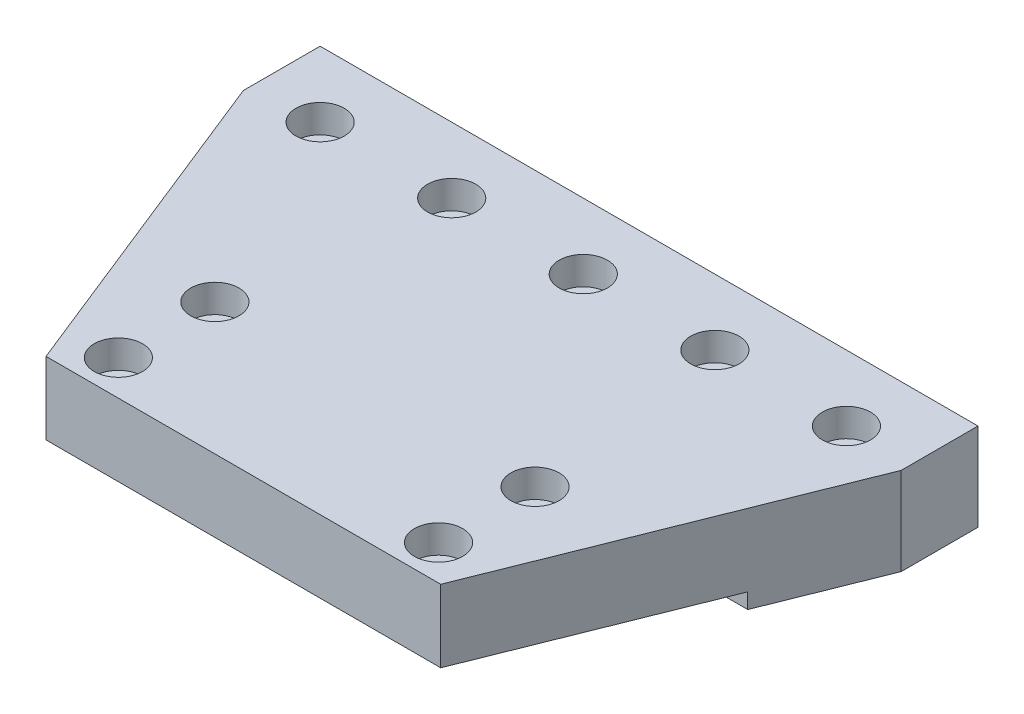
ISO-10303-21;
HEADER;
FILE_DESCRIPTION(('STEP AP214'),'2;1');
FILE_NAME('part.step','',(''),(''),'','','');
FILE_SCHEMA(('AUTOMOTIVE_DESIGN { 1 0 10303 214 1 1 1 1 }'));
ENDSEC;
DATA;
#1=APPLICATION_CONTEXT('core data for automotive mechanical design processes');
#2=APPLICATION_PROTOCOL_DEFINITION('international standard','automotive_design',2000,#1);
#3=PRODUCT_CONTEXT('',#1,'mechanical');
#4=PRODUCT('Part','Part','',(#3));
#5=PRODUCT_RELATED_PRODUCT_CATEGORY('part','',(#4));
#6=PRODUCT_DEFINITION_FORMATION('','',#4);
#7=PRODUCT_DEFINITION_CONTEXT('part definition',#1,'design');
#8=PRODUCT_DEFINITION('design','',#6,#7);
#9=PRODUCT_DEFINITION_SHAPE('','',#8);
#10=(LENGTH_UNIT() NAMED_UNIT(*) SI_UNIT(.MILLI.,.METRE.));
#11=(NAMED_UNIT(*) PLANE_ANGLE_UNIT() SI_UNIT($,.RADIAN.));
#12=(NAMED_UNIT(*) SI_UNIT($,.STERADIAN.) SOLID_ANGLE_UNIT());
#13=UNCERTAINTY_MEASURE_WITH_UNIT(LENGTH_MEASURE(1.E-05),#10,'distance_accuracy_value','');
#14=(GEOMETRIC_REPRESENTATION_CONTEXT(3) GLOBAL_UNCERTAINTY_ASSIGNED_CONTEXT((#13)) GLOBAL_UNIT_ASSIGNED_CONTEXT((#10,
#11,#12)) REPRESENTATION_CONTEXT('',''));
#15=CARTESIAN_POINT('',(0.,0.,0.));
#16=DIRECTION('',(0.,0.,1.));
#17=DIRECTION('',(1.,0.,0.));
#18=AXIS2_PLACEMENT_3D('',#15,#16,#17);
#19=CARTESIAN_POINT('',(75.,10.,-46.25));
#20=DIRECTION('',(-1.,0.,0.));
#21=DIRECTION('',(0.,0.,1.));
#22=AXIS2_PLACEMENT_3D('',#19,#20,#21);
#23=PLANE('',#22);
#24=DIRECTION('',(0.,0.,-1.));
#25=VECTOR('',#24,1.);
#26=CARTESIAN_POINT('',(75.,10.,-46.25));
#27=LINE('',#26,#25);
#28=CARTESIAN_POINT('',(75.,10.,-28.7500000000007));
#29=VERTEX_POINT('',#28);
#30=CARTESIAN_POINT('',(75.,10.,-46.25));
#31=VERTEX_POINT('',#30);
#32=EDGE_CURVE('E317',#29,#31,#27,.T.);
#33=ORIENTED_EDGE('',*,*,#32,.F.);
#34=DIRECTION('',(0.,-1.,0.));
#35=VECTOR('',#34,1.);
#36=CARTESIAN_POINT('',(75.,10.,-28.7500000000007));
#37=LINE('',#36,#35);
#38=CARTESIAN_POINT('',(75.,-10.,-28.7500000000007));
#39=VERTEX_POINT('',#38);
#40=EDGE_CURVE('E152',#29,#39,#37,.T.);
#41=ORIENTED_EDGE('',*,*,#40,.T.);
#42=DIRECTION('',(0.,0.,-1.));
#43=VECTOR('',#42,1.);
#44=CARTESIAN_POINT('',(75.,-10.,-46.25));
#45=LINE('',#44,#43);
#46=CARTESIAN_POINT('',(75.,-10.,-46.25));
#47=VERTEX_POINT('',#46);
#48=EDGE_CURVE('E316',#39,#47,#45,.T.);
#49=ORIENTED_EDGE('',*,*,#48,.T.);
#50=DIRECTION('',(0.,-1.,0.));
#51=VECTOR('',#50,1.);
#52=CARTESIAN_POINT('',(75.,10.,-46.25));
#53=LINE('',#52,#51);
#54=EDGE_CURVE('E146',#31,#47,#53,.T.);
#55=ORIENTED_EDGE('',*,*,#54,.F.);
#56=EDGE_LOOP('',(#33,#41,#49,#55));
#57=FACE_BOUND('',#56,.T.);
#58=ADVANCED_FACE('F45',(#57),#23,.F.);
#59=CARTESIAN_POINT('',(-75.,10.,-46.25));
#60=DIRECTION('',(0.,0.,1.));
#61=DIRECTION('',(1.,0.,0.));
#62=AXIS2_PLACEMENT_3D('',#59,#60,#61);
#63=PLANE('',#62);
#64=DIRECTION('',(-1.,0.,0.));
#65=VECTOR('',#64,1.);
#66=CARTESIAN_POINT('',(-75.,-10.,-46.25));
#67=LINE('',#66,#65);
#68=CARTESIAN_POINT('',(-75.,-10.,-46.25));
#69=VERTEX_POINT('',#68);
#70=EDGE_CURVE('E334',#47,#69,#67,.T.);
#71=ORIENTED_EDGE('',*,*,#70,.T.);
#72=DIRECTION('',(0.,-1.,0.));
#73=VECTOR('',#72,1.);
#74=CARTESIAN_POINT('',(-75.,10.,-46.25));
#75=LINE('',#74,#73);
#76=CARTESIAN_POINT('',(-75.,10.,-46.25));
#77=VERTEX_POINT('',#76);
#78=EDGE_CURVE('E331',#77,#69,#75,.T.);
#79=ORIENTED_EDGE('',*,*,#78,.F.);
#80=DIRECTION('',(-1.,0.,0.));
#81=VECTOR('',#80,1.);
#82=CARTESIAN_POINT('',(-75.,10.,-46.25));
#83=LINE('',#82,#81);
#84=EDGE_CURVE('E320',#31,#77,#83,.T.);
#85=ORIENTED_EDGE('',*,*,#84,.F.);
#86=ORIENTED_EDGE('',*,*,#54,.T.);
#87=EDGE_LOOP('',(#71,#79,#85,#86));
#88=FACE_BOUND('',#87,.T.);
#89=ADVANCED_FACE('F346',(#88),#63,.F.);
#90=CARTESIAN_POINT('',(-75.,10.,-46.25));
#91=DIRECTION('',(1.,0.,0.));
#92=DIRECTION('',(0.,0.,-1.));
#93=AXIS2_PLACEMENT_3D('',#90,#91,#92);
#94=PLANE('',#93);
#95=DIRECTION('',(0.,0.,1.));
#96=VECTOR('',#95,1.);
#97=CARTESIAN_POINT('',(-75.,-10.,-46.25));
#98=LINE('',#97,#96);
#99=CARTESIAN_POINT('',(-75.,-10.,-28.7500000000007));
#100=VERTEX_POINT('',#99);
#101=EDGE_CURVE('E321',#69,#100,#98,.T.);
#102=ORIENTED_EDGE('',*,*,#101,.T.);
#103=DIRECTION('',(0.,1.,0.));
#104=VECTOR('',#103,1.);
#105=CARTESIAN_POINT('',(-75.,10.,-28.7500000000007));
#106=LINE('',#105,#104);
#107=CARTESIAN_POINT('',(-75.,10.,-28.7500000000007));
#108=VERTEX_POINT('',#107);
#109=EDGE_CURVE('E137',#100,#108,#106,.T.);
#110=ORIENTED_EDGE('',*,*,#109,.T.);
#111=DIRECTION('',(0.,0.,1.));
#112=VECTOR('',#111,1.);
#113=CARTESIAN_POINT('',(-75.,10.,-46.25));
#114=LINE('',#113,#112);
#115=EDGE_CURVE('E324',#77,#108,#114,.T.);
#116=ORIENTED_EDGE('',*,*,#115,.F.);
#117=ORIENTED_EDGE('',*,*,#78,.T.);
#118=EDGE_LOOP('',(#102,#110,#116,#117));
#119=FACE_BOUND('',#118,.T.);
#120=ADVANCED_FACE('F353',(#119),#94,.F.);
#121=CARTESIAN_POINT('',(-75.,10.,46.25));
#122=DIRECTION('',(0.,0.,-1.));
#123=DIRECTION('',(-1.,0.,0.));
#124=AXIS2_PLACEMENT_3D('',#121,#122,#123);
#125=PLANE('',#124);
#126=DIRECTION('',(0.,-1.,0.));
#127=VECTOR('',#126,1.);
#128=CARTESIAN_POINT('',(-44.9999999999999,10.,46.25));
#129=LINE('',#128,#127);
#130=CARTESIAN_POINT('',(-44.9999999999999,10.,46.25));
#131=VERTEX_POINT('',#130);
#132=CARTESIAN_POINT('',(-44.9999999999999,-6.5,46.25));
#133=VERTEX_POINT('',#132);
#134=EDGE_CURVE('E139',#131,#133,#129,.T.);
#135=ORIENTED_EDGE('',*,*,#134,.T.);
#136=DIRECTION('',(1.,0.,0.));
#137=VECTOR('',#136,1.);
#138=CARTESIAN_POINT('',(-75.,-6.5,46.25));
#139=LINE('',#138,#137);
#140=CARTESIAN_POINT('',(44.9999999999999,-6.5,46.25));
#141=VERTEX_POINT('',#140);
#142=EDGE_CURVE('E184',#133,#141,#139,.T.);
#143=ORIENTED_EDGE('',*,*,#142,.T.);
#144=DIRECTION('',(0.,1.,0.));
#145=VECTOR('',#144,1.);
#146=CARTESIAN_POINT('',(44.9999999999999,10.,46.25));
#147=LINE('',#146,#145);
#148=CARTESIAN_POINT('',(44.9999999999999,10.,46.25));
#149=VERTEX_POINT('',#148);
#150=EDGE_CURVE('E69',#141,#149,#147,.T.);
#151=ORIENTED_EDGE('',*,*,#150,.T.);
#152=DIRECTION('',(1.,0.,0.));
#153=VECTOR('',#152,1.);
#154=CARTESIAN_POINT('',(-75.,10.,46.25));
#155=LINE('',#154,#153);
#156=EDGE_CURVE('E328',#131,#149,#155,.T.);
#157=ORIENTED_EDGE('',*,*,#156,.F.);
#158=EDGE_LOOP('',(#135,#143,#151,#157));
#159=FACE_BOUND('',#158,.T.);
#160=ADVANCED_FACE('F358',(#159),#125,.F.);
#161=CARTESIAN_POINT('',(0.,10.,0.));
#162=DIRECTION('',(0.,1.,0.));
#163=DIRECTION('',(0.,0.,1.));
#164=AXIS2_PLACEMENT_3D('',#161,#162,#163);
#165=PLANE('',#164);
#166=CARTESIAN_POINT('',(-36.5,10.,38.25));
#167=DIRECTION('',(0.,1.,0.));
#168=DIRECTION('',(0.,0.,1.));
#169=AXIS2_PLACEMENT_3D('',#166,#167,#168);
#170=CIRCLE('',#169,5.49999999999999);
#171=CARTESIAN_POINT('',(-36.5,10.,43.75));
#172=VERTEX_POINT('',#171);
#173=EDGE_CURVE('E121',#172,#172,#170,.T.);
#174=ORIENTED_EDGE('',*,*,#173,.F.);
#175=EDGE_LOOP('',(#174));
#176=FACE_BOUND('',#175,.T.);
#177=CARTESIAN_POINT('',(-36.5,10.,16.25));
#178=DIRECTION('',(0.,1.,0.));
#179=DIRECTION('',(0.,0.,1.));
#180=AXIS2_PLACEMENT_3D('',#177,#178,#179);
#181=CIRCLE('',#180,5.49999999999999);
#182=CARTESIAN_POINT('',(-36.5,10.,21.75));
#183=VERTEX_POINT('',#182);
#184=EDGE_CURVE('E200',#183,#183,#181,.T.);
#185=ORIENTED_EDGE('',*,*,#184,.F.);
#186=EDGE_LOOP('',(#185));
#187=FACE_BOUND('',#186,.T.);
#188=CARTESIAN_POINT('',(36.5,10.,16.25));
#189=DIRECTION('',(0.,1.,0.));
#190=DIRECTION('',(0.,0.,1.));
#191=AXIS2_PLACEMENT_3D('',#188,#189,#190);
#192=CIRCLE('',#191,5.49999999999999);
#193=CARTESIAN_POINT('',(36.5,10.,21.75));
#194=VERTEX_POINT('',#193);
#195=EDGE_CURVE('E212',#194,#194,#192,.T.);
#196=ORIENTED_EDGE('',*,*,#195,.F.);
#197=EDGE_LOOP('',(#196));
#198=FACE_BOUND('',#197,.T.);
#199=CARTESIAN_POINT('',(36.5,10.,38.25));
#200=DIRECTION('',(0.,1.,0.));
#201=DIRECTION('',(0.,0.,1.));
#202=AXIS2_PLACEMENT_3D('',#199,#200,#201);
#203=CIRCLE('',#202,5.49999999999999);
#204=CARTESIAN_POINT('',(36.5,10.,43.75));
#205=VERTEX_POINT('',#204);
#206=EDGE_CURVE('E224',#205,#205,#203,.T.);
#207=ORIENTED_EDGE('',*,*,#206,.F.);
#208=EDGE_LOOP('',(#207));
#209=FACE_BOUND('',#208,.T.);
#210=CARTESIAN_POINT('',(-60.,10.,-31.25));
#211=DIRECTION('',(0.,1.,0.));
#212=DIRECTION('',(0.,0.,1.));
#213=AXIS2_PLACEMENT_3D('',#210,#211,#212);
#214=CIRCLE('',#213,5.49999999999999);
#215=CARTESIAN_POINT('',(-60.,10.,-25.75));
#216=VERTEX_POINT('',#215);
#217=EDGE_CURVE('E236',#216,#216,#214,.T.);
#218=ORIENTED_EDGE('',*,*,#217,.F.);
#219=EDGE_LOOP('',(#218));
#220=FACE_BOUND('',#219,.T.);
#221=CARTESIAN_POINT('',(-30.,10.,-31.25));
#222=DIRECTION('',(0.,1.,0.));
#223=DIRECTION('',(0.,0.,1.));
#224=AXIS2_PLACEMENT_3D('',#221,#222,#223);
#225=CIRCLE('',#224,5.49999999999999);
#226=CARTESIAN_POINT('',(-30.,10.,-25.75));
#227=VERTEX_POINT('',#226);
#228=EDGE_CURVE('E252',#227,#227,#225,.T.);
#229=ORIENTED_EDGE('',*,*,#228,.F.);
#230=EDGE_LOOP('',(#229));
#231=FACE_BOUND('',#230,.T.);
#232=CARTESIAN_POINT('',(0.,10.,-31.25));
#233=DIRECTION('',(0.,1.,0.));
#234=DIRECTION('',(0.,0.,1.));
#235=AXIS2_PLACEMENT_3D('',#232,#233,#234);
#236=CIRCLE('',#235,5.49999999999999);
#237=CARTESIAN_POINT('',(0.,10.,-25.75));
#238=VERTEX_POINT('',#237);
#239=EDGE_CURVE('E268',#238,#238,#236,.T.);
#240=ORIENTED_EDGE('',*,*,#239,.F.);
#241=EDGE_LOOP('',(#240));
#242=FACE_BOUND('',#241,.T.);
#243=CARTESIAN_POINT('',(30.,10.,-31.25));
#244=DIRECTION('',(0.,1.,0.));
#245=DIRECTION('',(0.,0.,1.));
#246=AXIS2_PLACEMENT_3D('',#243,#244,#245);
#247=CIRCLE('',#246,5.49999999999999);
#248=CARTESIAN_POINT('',(30.,10.,-25.75));
#249=VERTEX_POINT('',#248);
#250=EDGE_CURVE('E284',#249,#249,#247,.T.);
#251=ORIENTED_EDGE('',*,*,#250,.F.);
#252=EDGE_LOOP('',(#251));
#253=FACE_BOUND('',#252,.T.);
#254=CARTESIAN_POINT('',(60.,10.,-31.25));
#255=DIRECTION('',(0.,1.,0.));
#256=DIRECTION('',(0.,0.,1.));
#257=AXIS2_PLACEMENT_3D('',#254,#255,#256);
#258=CIRCLE('',#257,5.49999999999999);
#259=CARTESIAN_POINT('',(60.,10.,-25.75));
#260=VERTEX_POINT('',#259);
#261=EDGE_CURVE('E300',#260,#260,#258,.T.);
#262=ORIENTED_EDGE('',*,*,#261,.F.);
#263=EDGE_LOOP('',(#262));
#264=FACE_BOUND('',#263,.T.);
#265=ORIENTED_EDGE('',*,*,#156,.T.);
#266=DIRECTION('',(-0.371390676354101,0.,0.92847669088526));
#267=VECTOR('',#266,1.);
#268=CARTESIAN_POINT('',(54.7413793103448,10.,21.8965517241377));
#269=LINE('',#268,#267);
#270=EDGE_CURVE('E55',#149,#29,#269,.F.);
#271=ORIENTED_EDGE('',*,*,#270,.T.);
#272=ORIENTED_EDGE('',*,*,#32,.T.);
#273=ORIENTED_EDGE('',*,*,#84,.T.);
#274=ORIENTED_EDGE('',*,*,#115,.T.);
#275=DIRECTION('',(-0.371390676354102,0.,-0.92847669088526));
#276=VECTOR('',#275,1.);
#277=CARTESIAN_POINT('',(-54.7413793103448,10.,21.8965517241378));
#278=LINE('',#277,#276);
#279=EDGE_CURVE('E143',#108,#131,#278,.F.);
#280=ORIENTED_EDGE('',*,*,#279,.T.);
#281=EDGE_LOOP('',(#265,#271,#272,#273,#274,#280));
#282=FACE_BOUND('',#281,.T.);
#283=ADVANCED_FACE('F356',(#176,#187,#198,#209,#220,#231,#242,#253,#264,#282),#165,.T.);
#284=CARTESIAN_POINT('',(0.,-10.,0.));
#285=DIRECTION('',(0.,1.,0.));
#286=DIRECTION('',(0.,0.,1.));
#287=AXIS2_PLACEMENT_3D('',#284,#285,#286);
#288=PLANE('',#287);
#289=CARTESIAN_POINT('',(-60.,-10.,-31.25));
#290=DIRECTION('',(0.,1.,0.));
#291=DIRECTION('',(0.,0.,1.));
#292=AXIS2_PLACEMENT_3D('',#289,#290,#291);
#293=CIRCLE('',#292,3.3);
#294=CARTESIAN_POINT('',(-60.,-10.,-27.95));
#295=VERTEX_POINT('',#294);
#296=EDGE_CURVE('E248',#295,#295,#293,.T.);
#297=ORIENTED_EDGE('',*,*,#296,.T.);
#298=EDGE_LOOP('',(#297));
#299=FACE_BOUND('',#298,.T.);
#300=CARTESIAN_POINT('',(-30.,-10.,-31.25));
#301=DIRECTION('',(0.,1.,0.));
#302=DIRECTION('',(0.,0.,1.));
#303=AXIS2_PLACEMENT_3D('',#300,#301,#302);
#304=CIRCLE('',#303,3.29999999999999);
#305=CARTESIAN_POINT('',(-30.,-10.,-27.95));
#306=VERTEX_POINT('',#305);
#307=EDGE_CURVE('E264',#306,#306,#304,.T.);
#308=ORIENTED_EDGE('',*,*,#307,.T.);
#309=EDGE_LOOP('',(#308));
#310=FACE_BOUND('',#309,.T.);
#311=CARTESIAN_POINT('',(0.,-10.,-31.25));
#312=DIRECTION('',(0.,1.,0.));
#313=DIRECTION('',(0.,0.,1.));
#314=AXIS2_PLACEMENT_3D('',#311,#312,#313);
#315=CIRCLE('',#314,3.29999999999999);
#316=CARTESIAN_POINT('',(0.,-10.,-27.95));
#317=VERTEX_POINT('',#316);
#318=EDGE_CURVE('E280',#317,#317,#315,.T.);
#319=ORIENTED_EDGE('',*,*,#318,.T.);
#320=EDGE_LOOP('',(#319));
#321=FACE_BOUND('',#320,.T.);
#322=CARTESIAN_POINT('',(30.,-10.,-31.25));
#323=DIRECTION('',(0.,1.,0.));
#324=DIRECTION('',(0.,0.,1.));
#325=AXIS2_PLACEMENT_3D('',#322,#323,#324);
#326=CIRCLE('',#325,3.3);
#327=CARTESIAN_POINT('',(30.,-10.,-27.95));
#328=VERTEX_POINT('',#327);
#329=EDGE_CURVE('E296',#328,#328,#326,.T.);
#330=ORIENTED_EDGE('',*,*,#329,.T.);
#331=EDGE_LOOP('',(#330));
#332=FACE_BOUND('',#331,.T.);
#333=CARTESIAN_POINT('',(60.,-10.,-31.25));
#334=DIRECTION('',(0.,1.,0.));
#335=DIRECTION('',(0.,0.,1.));
#336=AXIS2_PLACEMENT_3D('',#333,#334,#335);
#337=CIRCLE('',#336,3.3);
#338=CARTESIAN_POINT('',(60.,-10.,-27.95));
#339=VERTEX_POINT('',#338);
#340=EDGE_CURVE('E312',#339,#339,#337,.T.);
#341=ORIENTED_EDGE('',*,*,#340,.T.);
#342=EDGE_LOOP('',(#341));
#343=FACE_BOUND('',#342,.T.);
#344=DIRECTION('',(0.371390676354101,0.,-0.92847669088526));
#345=VECTOR('',#344,1.);
#346=CARTESIAN_POINT('',(75.,-10.,-28.7500000000007));
#347=LINE('',#346,#345);
#348=CARTESIAN_POINT('',(64.9999999999998,-10.,-3.75000000000001));
#349=VERTEX_POINT('',#348);
#350=EDGE_CURVE('E131',#39,#349,#347,.F.);
#351=ORIENTED_EDGE('',*,*,#350,.T.);
#352=DIRECTION('',(1.,0.,0.));
#353=VECTOR('',#352,1.);
#354=CARTESIAN_POINT('',(-75.,-10.,-3.75));
#355=LINE('',#354,#353);
#356=CARTESIAN_POINT('',(-64.9999999999998,-10.,-3.75000000000001));
#357=VERTEX_POINT('',#356);
#358=EDGE_CURVE('E115',#357,#349,#355,.T.);
#359=ORIENTED_EDGE('',*,*,#358,.F.);
#360=DIRECTION('',(0.371390676354102,0.,0.92847669088526));
#361=VECTOR('',#360,1.);
#362=CARTESIAN_POINT('',(-44.9999999999999,-10.,46.25));
#363=LINE('',#362,#361);
#364=EDGE_CURVE('E128',#357,#100,#363,.F.);
#365=ORIENTED_EDGE('',*,*,#364,.T.);
#366=ORIENTED_EDGE('',*,*,#101,.F.);
#367=ORIENTED_EDGE('',*,*,#70,.F.);
#368=ORIENTED_EDGE('',*,*,#48,.F.);
#369=EDGE_LOOP('',(#351,#359,#365,#366,#367,#368));
#370=FACE_BOUND('',#369,.T.);
#371=ADVANCED_FACE('F126',(#299,#310,#321,#332,#343,#370),#288,.F.);
#372=CARTESIAN_POINT('',(-44.9999999999999,10.,46.25));
#373=DIRECTION('',(0.92847669088526,0.,-0.371390676354101));
#374=DIRECTION('',(0.,-1.,0.));
#375=AXIS2_PLACEMENT_3D('',#372,#373,#374);
#376=PLANE('',#375);
#377=DIRECTION('',(0.,1.,0.));
#378=VECTOR('',#377,1.);
#379=CARTESIAN_POINT('',(-64.9999999999998,10.,-3.75));
#380=LINE('',#379,#378);
#381=CARTESIAN_POINT('',(-64.9999999999998,-6.5,-3.75000000000001));
#382=VERTEX_POINT('',#381);
#383=EDGE_CURVE('E112',#382,#357,#380,.F.);
#384=ORIENTED_EDGE('',*,*,#383,.F.);
#385=DIRECTION('',(0.371390676354102,0.,0.92847669088526));
#386=VECTOR('',#385,1.);
#387=CARTESIAN_POINT('',(-44.9999999999999,-6.5,46.25));
#388=LINE('',#387,#386);
#389=EDGE_CURVE('E122',#133,#382,#388,.F.);
#390=ORIENTED_EDGE('',*,*,#389,.F.);
#391=ORIENTED_EDGE('',*,*,#134,.F.);
#392=ORIENTED_EDGE('',*,*,#279,.F.);
#393=ORIENTED_EDGE('',*,*,#109,.F.);
#394=ORIENTED_EDGE('',*,*,#364,.F.);
#395=EDGE_LOOP('',(#384,#390,#391,#392,#393,#394));
#396=FACE_BOUND('',#395,.T.);
#397=ADVANCED_FACE('F135',(#396),#376,.F.);
#398=CARTESIAN_POINT('',(75.,10.,-28.7500000000007));
#399=DIRECTION('',(-0.92847669088526,0.,-0.371390676354101));
#400=DIRECTION('',(0.,-1.,0.));
#401=AXIS2_PLACEMENT_3D('',#398,#399,#400);
#402=PLANE('',#401);
#403=DIRECTION('',(0.,-1.,0.));
#404=VECTOR('',#403,1.);
#405=CARTESIAN_POINT('',(64.9999999999998,10.,-3.75));
#406=LINE('',#405,#404);
#407=CARTESIAN_POINT('',(64.9999999999998,-6.5,-3.75000000000001));
#408=VERTEX_POINT('',#407);
#409=EDGE_CURVE('E11',#349,#408,#406,.F.);
#410=ORIENTED_EDGE('',*,*,#409,.F.);
#411=ORIENTED_EDGE('',*,*,#350,.F.);
#412=ORIENTED_EDGE('',*,*,#40,.F.);
#413=ORIENTED_EDGE('',*,*,#270,.F.);
#414=ORIENTED_EDGE('',*,*,#150,.F.);
#415=DIRECTION('',(0.371390676354101,0.,-0.92847669088526));
#416=VECTOR('',#415,1.);
#417=CARTESIAN_POINT('',(75.,-6.5,-28.7500000000007));
#418=LINE('',#417,#416);
#419=EDGE_CURVE('E181',#408,#141,#418,.F.);
#420=ORIENTED_EDGE('',*,*,#419,.F.);
#421=EDGE_LOOP('',(#410,#411,#412,#413,#414,#420));
#422=FACE_BOUND('',#421,.T.);
#423=ADVANCED_FACE('F48',(#422),#402,.F.);
#424=CARTESIAN_POINT('',(60.,10.,-31.25));
#425=DIRECTION('',(0.,1.,0.));
#426=DIRECTION('',(0.,0.,1.));
#427=AXIS2_PLACEMENT_3D('',#424,#425,#426);
#428=CYLINDRICAL_SURFACE('',#427,3.3);
#429=ORIENTED_EDGE('',*,*,#340,.F.);
#430=EDGE_LOOP('',(#429));
#431=FACE_BOUND('',#430,.T.);
#432=CARTESIAN_POINT('',(60.,3.6,-31.25));
#433=DIRECTION('',(0.,1.,0.));
#434=DIRECTION('',(0.,0.,1.));
#435=AXIS2_PLACEMENT_3D('',#432,#433,#434);
#436=CIRCLE('',#435,3.30000000000001);
#437=CARTESIAN_POINT('',(60.,3.6,-27.95));
#438=VERTEX_POINT('',#437);
#439=EDGE_CURVE('E308',#438,#438,#436,.T.);
#440=ORIENTED_EDGE('',*,*,#439,.T.);
#441=EDGE_LOOP('',(#440));
#442=FACE_BOUND('',#441,.T.);
#443=ADVANCED_FACE('F421',(#431,#442),#428,.F.);
#444=CARTESIAN_POINT('',(63.3,3.6,-31.25));
#445=DIRECTION('',(0.,-1.,0.));
#446=DIRECTION('',(0.,0.,-1.));
#447=AXIS2_PLACEMENT_3D('',#444,#445,#446);
#448=PLANE('',#447);
#449=ORIENTED_EDGE('',*,*,#439,.F.);
#450=EDGE_LOOP('',(#449));
#451=FACE_BOUND('',#450,.T.);
#452=CARTESIAN_POINT('',(60.,3.6,-31.25));
#453=DIRECTION('',(0.,1.,0.));
#454=DIRECTION('',(0.,0.,1.));
#455=AXIS2_PLACEMENT_3D('',#452,#453,#454);
#456=CIRCLE('',#455,5.49999999999999);
#457=CARTESIAN_POINT('',(60.,3.6,-25.75));
#458=VERTEX_POINT('',#457);
#459=EDGE_CURVE('E304',#458,#458,#456,.T.);
#460=ORIENTED_EDGE('',*,*,#459,.T.);
#461=EDGE_LOOP('',(#460));
#462=FACE_BOUND('',#461,.T.);
#463=ADVANCED_FACE('F411',(#451,#462),#448,.F.);
#464=CARTESIAN_POINT('',(60.,10.,-31.25));
#465=DIRECTION('',(0.,1.,0.));
#466=DIRECTION('',(0.,0.,1.));
#467=AXIS2_PLACEMENT_3D('',#464,#465,#466);
#468=CYLINDRICAL_SURFACE('',#467,5.49999999999999);
#469=ORIENTED_EDGE('',*,*,#459,.F.);
#470=EDGE_LOOP('',(#469));
#471=FACE_BOUND('',#470,.T.);
#472=ORIENTED_EDGE('',*,*,#261,.T.);
#473=EDGE_LOOP('',(#472));
#474=FACE_BOUND('',#473,.T.);
#475=ADVANCED_FACE('F408',(#471,#474),#468,.F.);
#476=CARTESIAN_POINT('',(30.,10.,-31.25));
#477=DIRECTION('',(0.,1.,0.));
#478=DIRECTION('',(0.,0.,1.));
#479=AXIS2_PLACEMENT_3D('',#476,#477,#478);
#480=CYLINDRICAL_SURFACE('',#479,3.3);
#481=ORIENTED_EDGE('',*,*,#329,.F.);
#482=EDGE_LOOP('',(#481));
#483=FACE_BOUND('',#482,.T.);
#484=CARTESIAN_POINT('',(30.,3.6,-31.25));
#485=DIRECTION('',(0.,1.,0.));
#486=DIRECTION('',(0.,0.,1.));
#487=AXIS2_PLACEMENT_3D('',#484,#485,#486);
#488=CIRCLE('',#487,3.30000000000001);
#489=CARTESIAN_POINT('',(30.,3.6,-27.95));
#490=VERTEX_POINT('',#489);
#491=EDGE_CURVE('E292',#490,#490,#488,.T.);
#492=ORIENTED_EDGE('',*,*,#491,.T.);
#493=EDGE_LOOP('',(#492));
#494=FACE_BOUND('',#493,.T.);
#495=ADVANCED_FACE('F410',(#483,#494),#480,.F.);
#496=CARTESIAN_POINT('',(33.3,3.6,-31.25));
#497=DIRECTION('',(0.,-1.,0.));
#498=DIRECTION('',(0.,0.,-1.));
#499=AXIS2_PLACEMENT_3D('',#496,#497,#498);
#500=PLANE('',#499);
#501=ORIENTED_EDGE('',*,*,#491,.F.);
#502=EDGE_LOOP('',(#501));
#503=FACE_BOUND('',#502,.T.);
#504=CARTESIAN_POINT('',(30.,3.6,-31.25));
#505=DIRECTION('',(0.,1.,0.));
#506=DIRECTION('',(0.,0.,1.));
#507=AXIS2_PLACEMENT_3D('',#504,#505,#506);
#508=CIRCLE('',#507,5.49999999999999);
#509=CARTESIAN_POINT('',(30.,3.6,-25.75));
#510=VERTEX_POINT('',#509);
#511=EDGE_CURVE('E288',#510,#510,#508,.T.);
#512=ORIENTED_EDGE('',*,*,#511,.T.);
#513=EDGE_LOOP('',(#512));
#514=FACE_BOUND('',#513,.T.);
#515=ADVANCED_FACE('F418',(#503,#514),#500,.F.);
#516=CARTESIAN_POINT('',(30.,10.,-31.25));
#517=DIRECTION('',(0.,1.,0.));
#518=DIRECTION('',(0.,0.,1.));
#519=AXIS2_PLACEMENT_3D('',#516,#517,#518);
#520=CYLINDRICAL_SURFACE('',#519,5.49999999999999);
#521=ORIENTED_EDGE('',*,*,#511,.F.);
#522=EDGE_LOOP('',(#521));
#523=FACE_BOUND('',#522,.T.);
#524=ORIENTED_EDGE('',*,*,#250,.T.);
#525=EDGE_LOOP('',(#524));
#526=FACE_BOUND('',#525,.T.);
#527=ADVANCED_FACE('F692',(#523,#526),#520,.F.);
#528=CARTESIAN_POINT('',(0.,10.,-31.25));
#529=DIRECTION('',(0.,1.,0.));
#530=DIRECTION('',(0.,0.,1.));
#531=AXIS2_PLACEMENT_3D('',#528,#529,#530);
#532=CYLINDRICAL_SURFACE('',#531,3.3);
#533=ORIENTED_EDGE('',*,*,#318,.F.);
#534=EDGE_LOOP('',(#533));
#535=FACE_BOUND('',#534,.T.);
#536=CARTESIAN_POINT('',(0.,3.6,-31.25));
#537=DIRECTION('',(0.,1.,0.));
#538=DIRECTION('',(0.,0.,1.));
#539=AXIS2_PLACEMENT_3D('',#536,#537,#538);
#540=CIRCLE('',#539,3.30000000000001);
#541=CARTESIAN_POINT('',(0.,3.6,-27.95));
#542=VERTEX_POINT('',#541);
#543=EDGE_CURVE('E276',#542,#542,#540,.T.);
#544=ORIENTED_EDGE('',*,*,#543,.T.);
#545=EDGE_LOOP('',(#544));
#546=FACE_BOUND('',#545,.T.);
#547=ADVANCED_FACE('F682',(#535,#546),#532,.F.);
#548=CARTESIAN_POINT('',(3.30000000000001,3.6,-31.25));
#549=DIRECTION('',(0.,-1.,0.));
#550=DIRECTION('',(0.,0.,-1.));
#551=AXIS2_PLACEMENT_3D('',#548,#549,#550);
#552=PLANE('',#551);
#553=ORIENTED_EDGE('',*,*,#543,.F.);
#554=EDGE_LOOP('',(#553));
#555=FACE_BOUND('',#554,.T.);
#556=CARTESIAN_POINT('',(0.,3.6,-31.25));
#557=DIRECTION('',(0.,1.,0.));
#558=DIRECTION('',(0.,0.,1.));
#559=AXIS2_PLACEMENT_3D('',#556,#557,#558);
#560=CIRCLE('',#559,5.49999999999999);
#561=CARTESIAN_POINT('',(0.,3.6,-25.75));
#562=VERTEX_POINT('',#561);
#563=EDGE_CURVE('E272',#562,#562,#560,.T.);
#564=ORIENTED_EDGE('',*,*,#563,.T.);
#565=EDGE_LOOP('',(#564));
#566=FACE_BOUND('',#565,.T.);
#567=ADVANCED_FACE('F672',(#555,#566),#552,.F.);
#568=CARTESIAN_POINT('',(0.,10.,-31.25));
#569=DIRECTION('',(0.,1.,0.));
#570=DIRECTION('',(0.,0.,1.));
#571=AXIS2_PLACEMENT_3D('',#568,#569,#570);
#572=CYLINDRICAL_SURFACE('',#571,5.49999999999999);
#573=ORIENTED_EDGE('',*,*,#563,.F.);
#574=EDGE_LOOP('',(#573));
#575=FACE_BOUND('',#574,.T.);
#576=ORIENTED_EDGE('',*,*,#239,.T.);
#577=EDGE_LOOP('',(#576));
#578=FACE_BOUND('',#577,.T.);
#579=ADVANCED_FACE('F662',(#575,#578),#572,.F.);
#580=CARTESIAN_POINT('',(-30.,10.,-31.25));
#581=DIRECTION('',(0.,1.,0.));
#582=DIRECTION('',(0.,0.,1.));
#583=AXIS2_PLACEMENT_3D('',#580,#581,#582);
#584=CYLINDRICAL_SURFACE('',#583,3.3);
#585=ORIENTED_EDGE('',*,*,#307,.F.);
#586=EDGE_LOOP('',(#585));
#587=FACE_BOUND('',#586,.T.);
#588=CARTESIAN_POINT('',(-30.,3.6,-31.25));
#589=DIRECTION('',(0.,1.,0.));
#590=DIRECTION('',(0.,0.,1.));
#591=AXIS2_PLACEMENT_3D('',#588,#589,#590);
#592=CIRCLE('',#591,3.30000000000001);
#593=CARTESIAN_POINT('',(-30.,3.6,-27.95));
#594=VERTEX_POINT('',#593);
#595=EDGE_CURVE('E260',#594,#594,#592,.T.);
#596=ORIENTED_EDGE('',*,*,#595,.T.);
#597=EDGE_LOOP('',(#596));
#598=FACE_BOUND('',#597,.T.);
#599=ADVANCED_FACE('F652',(#587,#598),#584,.F.);
#600=CARTESIAN_POINT('',(-26.7,3.6,-31.25));
#601=DIRECTION('',(0.,-1.,0.));
#602=DIRECTION('',(0.,0.,-1.));
#603=AXIS2_PLACEMENT_3D('',#600,#601,#602);
#604=PLANE('',#603);
#605=ORIENTED_EDGE('',*,*,#595,.F.);
#606=EDGE_LOOP('',(#605));
#607=FACE_BOUND('',#606,.T.);
#608=CARTESIAN_POINT('',(-30.,3.6,-31.25));
#609=DIRECTION('',(0.,1.,0.));
#610=DIRECTION('',(0.,0.,1.));
#611=AXIS2_PLACEMENT_3D('',#608,#609,#610);
#612=CIRCLE('',#611,5.49999999999999);
#613=CARTESIAN_POINT('',(-30.,3.6,-25.75));
#614=VERTEX_POINT('',#613);
#615=EDGE_CURVE('E256',#614,#614,#612,.T.);
#616=ORIENTED_EDGE('',*,*,#615,.T.);
#617=EDGE_LOOP('',(#616));
#618=FACE_BOUND('',#617,.T.);
#619=ADVANCED_FACE('F642',(#607,#618),#604,.F.);
#620=CARTESIAN_POINT('',(-30.,10.,-31.25));
#621=DIRECTION('',(0.,1.,0.));
#622=DIRECTION('',(0.,0.,1.));
#623=AXIS2_PLACEMENT_3D('',#620,#621,#622);
#624=CYLINDRICAL_SURFACE('',#623,5.49999999999999);
#625=ORIENTED_EDGE('',*,*,#615,.F.);
#626=EDGE_LOOP('',(#625));
#627=FACE_BOUND('',#626,.T.);
#628=ORIENTED_EDGE('',*,*,#228,.T.);
#629=EDGE_LOOP('',(#628));
#630=FACE_BOUND('',#629,.T.);
#631=ADVANCED_FACE('F632',(#627,#630),#624,.F.);
#632=CARTESIAN_POINT('',(-60.,10.,-31.25));
#633=DIRECTION('',(0.,1.,0.));
#634=DIRECTION('',(0.,0.,1.));
#635=AXIS2_PLACEMENT_3D('',#632,#633,#634);
#636=CYLINDRICAL_SURFACE('',#635,3.3);
#637=ORIENTED_EDGE('',*,*,#296,.F.);
#638=EDGE_LOOP('',(#637));
#639=FACE_BOUND('',#638,.T.);
#640=CARTESIAN_POINT('',(-60.,3.6,-31.25));
#641=DIRECTION('',(0.,1.,0.));
#642=DIRECTION('',(0.,0.,1.));
#643=AXIS2_PLACEMENT_3D('',#640,#641,#642);
#644=CIRCLE('',#643,3.30000000000001);
#645=CARTESIAN_POINT('',(-60.,3.6,-27.95));
#646=VERTEX_POINT('',#645);
#647=EDGE_CURVE('E244',#646,#646,#644,.T.);
#648=ORIENTED_EDGE('',*,*,#647,.T.);
#649=EDGE_LOOP('',(#648));
#650=FACE_BOUND('',#649,.T.);
#651=ADVANCED_FACE('F623',(#639,#650),#636,.F.);
#652=CARTESIAN_POINT('',(-56.7,3.6,-31.25));
#653=DIRECTION('',(0.,-1.,0.));
#654=DIRECTION('',(0.,0.,-1.));
#655=AXIS2_PLACEMENT_3D('',#652,#653,#654);
#656=PLANE('',#655);
#657=ORIENTED_EDGE('',*,*,#647,.F.);
#658=EDGE_LOOP('',(#657));
#659=FACE_BOUND('',#658,.T.);
#660=CARTESIAN_POINT('',(-60.,3.6,-31.25));
#661=DIRECTION('',(0.,1.,0.));
#662=DIRECTION('',(0.,0.,1.));
#663=AXIS2_PLACEMENT_3D('',#660,#661,#662);
#664=CIRCLE('',#663,5.49999999999999);
#665=CARTESIAN_POINT('',(-60.,3.6,-25.75));
#666=VERTEX_POINT('',#665);
#667=EDGE_CURVE('E240',#666,#666,#664,.T.);
#668=ORIENTED_EDGE('',*,*,#667,.T.);
#669=EDGE_LOOP('',(#668));
#670=FACE_BOUND('',#669,.T.);
#671=ADVANCED_FACE('F614',(#659,#670),#656,.F.);
#672=CARTESIAN_POINT('',(-60.,10.,-31.25));
#673=DIRECTION('',(0.,1.,0.));
#674=DIRECTION('',(0.,0.,1.));
#675=AXIS2_PLACEMENT_3D('',#672,#673,#674);
#676=CYLINDRICAL_SURFACE('',#675,5.49999999999999);
#677=ORIENTED_EDGE('',*,*,#667,.F.);
#678=EDGE_LOOP('',(#677));
#679=FACE_BOUND('',#678,.T.);
#680=ORIENTED_EDGE('',*,*,#217,.T.);
#681=EDGE_LOOP('',(#680));
#682=FACE_BOUND('',#681,.T.);
#683=ADVANCED_FACE('F378',(#679,#682),#676,.F.);
#684=CARTESIAN_POINT('',(36.5,10.,38.25));
#685=DIRECTION('',(0.,1.,0.));
#686=DIRECTION('',(0.,0.,1.));
#687=AXIS2_PLACEMENT_3D('',#684,#685,#686);
#688=CYLINDRICAL_SURFACE('',#687,3.3);
#689=CARTESIAN_POINT('',(36.5,-6.5,38.25));
#690=DIRECTION('',(0.,1.,0.));
#691=DIRECTION('',(0.,0.,1.));
#692=AXIS2_PLACEMENT_3D('',#689,#690,#691);
#693=CIRCLE('',#692,3.3);
#694=CARTESIAN_POINT('',(36.5,-6.5,41.55));
#695=VERTEX_POINT('',#694);
#696=EDGE_CURVE('E177',#695,#695,#693,.F.);
#697=ORIENTED_EDGE('',*,*,#696,.T.);
#698=EDGE_LOOP('',(#697));
#699=FACE_BOUND('',#698,.T.);
#700=CARTESIAN_POINT('',(36.5,3.6,38.25));
#701=DIRECTION('',(0.,1.,0.));
#702=DIRECTION('',(0.,0.,1.));
#703=AXIS2_PLACEMENT_3D('',#700,#701,#702);
#704=CIRCLE('',#703,3.30000000000001);
#705=CARTESIAN_POINT('',(36.5,3.6,41.55));
#706=VERTEX_POINT('',#705);
#707=EDGE_CURVE('E232',#706,#706,#704,.T.);
#708=ORIENTED_EDGE('',*,*,#707,.T.);
#709=EDGE_LOOP('',(#708));
#710=FACE_BOUND('',#709,.T.);
#711=ADVANCED_FACE('F374',(#699,#710),#688,.F.);
#712=CARTESIAN_POINT('',(39.8,3.6,38.25));
#713=DIRECTION('',(0.,-1.,0.));
#714=DIRECTION('',(0.,0.,-1.));
#715=AXIS2_PLACEMENT_3D('',#712,#713,#714);
#716=PLANE('',#715);
#717=ORIENTED_EDGE('',*,*,#707,.F.);
#718=EDGE_LOOP('',(#717));
#719=FACE_BOUND('',#718,.T.);
#720=CARTESIAN_POINT('',(36.5,3.6,38.25));
#721=DIRECTION('',(0.,1.,0.));
#722=DIRECTION('',(0.,0.,1.));
#723=AXIS2_PLACEMENT_3D('',#720,#721,#722);
#724=CIRCLE('',#723,5.49999999999999);
#725=CARTESIAN_POINT('',(36.5,3.6,43.75));
#726=VERTEX_POINT('',#725);
#727=EDGE_CURVE('E228',#726,#726,#724,.T.);
#728=ORIENTED_EDGE('',*,*,#727,.T.);
#729=EDGE_LOOP('',(#728));
#730=FACE_BOUND('',#729,.T.);
#731=ADVANCED_FACE('F377',(#719,#730),#716,.F.);
#732=CARTESIAN_POINT('',(36.5,10.,38.25));
#733=DIRECTION('',(0.,1.,0.));
#734=DIRECTION('',(0.,0.,1.));
#735=AXIS2_PLACEMENT_3D('',#732,#733,#734);
#736=CYLINDRICAL_SURFACE('',#735,5.49999999999999);
#737=ORIENTED_EDGE('',*,*,#727,.F.);
#738=EDGE_LOOP('',(#737));
#739=FACE_BOUND('',#738,.T.);
#740=ORIENTED_EDGE('',*,*,#206,.T.);
#741=EDGE_LOOP('',(#740));
#742=FACE_BOUND('',#741,.T.);
#743=ADVANCED_FACE('F384',(#739,#742),#736,.F.);
#744=CARTESIAN_POINT('',(36.5,10.,16.25));
#745=DIRECTION('',(0.,1.,0.));
#746=DIRECTION('',(0.,0.,1.));
#747=AXIS2_PLACEMENT_3D('',#744,#745,#746);
#748=CYLINDRICAL_SURFACE('',#747,3.3);
#749=CARTESIAN_POINT('',(36.5,-6.5,16.25));
#750=DIRECTION('',(0.,1.,0.));
#751=DIRECTION('',(0.,0.,1.));
#752=AXIS2_PLACEMENT_3D('',#749,#750,#751);
#753=CIRCLE('',#752,3.3);
#754=CARTESIAN_POINT('',(36.5,-6.5,19.55));
#755=VERTEX_POINT('',#754);
#756=EDGE_CURVE('E170',#755,#755,#753,.F.);
#757=ORIENTED_EDGE('',*,*,#756,.T.);
#758=EDGE_LOOP('',(#757));
#759=FACE_BOUND('',#758,.T.);
#760=CARTESIAN_POINT('',(36.5,3.6,16.25));
#761=DIRECTION('',(0.,1.,0.));
#762=DIRECTION('',(0.,0.,1.));
#763=AXIS2_PLACEMENT_3D('',#760,#761,#762);
#764=CIRCLE('',#763,3.30000000000001);
#765=CARTESIAN_POINT('',(36.5,3.6,19.55));
#766=VERTEX_POINT('',#765);
#767=EDGE_CURVE('E220',#766,#766,#764,.T.);
#768=ORIENTED_EDGE('',*,*,#767,.T.);
#769=EDGE_LOOP('',(#768));
#770=FACE_BOUND('',#769,.T.);
#771=ADVANCED_FACE('F390',(#759,#770),#748,.F.);
#772=CARTESIAN_POINT('',(39.8,3.6,16.25));
#773=DIRECTION('',(0.,-1.,0.));
#774=DIRECTION('',(0.,0.,-1.));
#775=AXIS2_PLACEMENT_3D('',#772,#773,#774);
#776=PLANE('',#775);
#777=ORIENTED_EDGE('',*,*,#767,.F.);
#778=EDGE_LOOP('',(#777));
#779=FACE_BOUND('',#778,.T.);
#780=CARTESIAN_POINT('',(36.5,3.6,16.25));
#781=DIRECTION('',(0.,1.,0.));
#782=DIRECTION('',(0.,0.,1.));
#783=AXIS2_PLACEMENT_3D('',#780,#781,#782);
#784=CIRCLE('',#783,5.49999999999999);
#785=CARTESIAN_POINT('',(36.5,3.6,21.75));
#786=VERTEX_POINT('',#785);
#787=EDGE_CURVE('E216',#786,#786,#784,.T.);
#788=ORIENTED_EDGE('',*,*,#787,.T.);
#789=EDGE_LOOP('',(#788));
#790=FACE_BOUND('',#789,.T.);
#791=ADVANCED_FACE('F491',(#779,#790),#776,.F.);
#792=CARTESIAN_POINT('',(36.5,10.,16.25));
#793=DIRECTION('',(0.,1.,0.));
#794=DIRECTION('',(0.,0.,1.));
#795=AXIS2_PLACEMENT_3D('',#792,#793,#794);
#796=CYLINDRICAL_SURFACE('',#795,5.49999999999999);
#797=ORIENTED_EDGE('',*,*,#787,.F.);
#798=EDGE_LOOP('',(#797));
#799=FACE_BOUND('',#798,.T.);
#800=ORIENTED_EDGE('',*,*,#195,.T.);
#801=EDGE_LOOP('',(#800));
#802=FACE_BOUND('',#801,.T.);
#803=ADVANCED_FACE('F496',(#799,#802),#796,.F.);
#804=CARTESIAN_POINT('',(-36.5,10.,16.25));
#805=DIRECTION('',(0.,1.,0.));
#806=DIRECTION('',(0.,0.,1.));
#807=AXIS2_PLACEMENT_3D('',#804,#805,#806);
#808=CYLINDRICAL_SURFACE('',#807,3.3);
#809=CARTESIAN_POINT('',(-36.5,-6.5,16.25));
#810=DIRECTION('',(0.,1.,0.));
#811=DIRECTION('',(0.,0.,1.));
#812=AXIS2_PLACEMENT_3D('',#809,#810,#811);
#813=CIRCLE('',#812,3.3);
#814=CARTESIAN_POINT('',(-36.5,-6.5,19.55));
#815=VERTEX_POINT('',#814);
#816=EDGE_CURVE('E164',#815,#815,#813,.F.);
#817=ORIENTED_EDGE('',*,*,#816,.T.);
#818=EDGE_LOOP('',(#817));
#819=FACE_BOUND('',#818,.T.);
#820=CARTESIAN_POINT('',(-36.5,3.6,16.25));
#821=DIRECTION('',(0.,1.,0.));
#822=DIRECTION('',(0.,0.,1.));
#823=AXIS2_PLACEMENT_3D('',#820,#821,#822);
#824=CIRCLE('',#823,3.30000000000001);
#825=CARTESIAN_POINT('',(-36.5,3.6,19.55));
#826=VERTEX_POINT('',#825);
#827=EDGE_CURVE('E208',#826,#826,#824,.T.);
#828=ORIENTED_EDGE('',*,*,#827,.T.);
#829=EDGE_LOOP('',(#828));
#830=FACE_BOUND('',#829,.T.);
#831=ADVANCED_FACE('F507',(#819,#830),#808,.F.);
#832=CARTESIAN_POINT('',(-33.2,3.6,16.25));
#833=DIRECTION('',(0.,-1.,0.));
#834=DIRECTION('',(0.,0.,-1.));
#835=AXIS2_PLACEMENT_3D('',#832,#833,#834);
#836=PLANE('',#835);
#837=ORIENTED_EDGE('',*,*,#827,.F.);
#838=EDGE_LOOP('',(#837));
#839=FACE_BOUND('',#838,.T.);
#840=CARTESIAN_POINT('',(-36.5,3.6,16.25));
#841=DIRECTION('',(0.,1.,0.));
#842=DIRECTION('',(0.,0.,1.));
#843=AXIS2_PLACEMENT_3D('',#840,#841,#842);
#844=CIRCLE('',#843,5.49999999999999);
#845=CARTESIAN_POINT('',(-36.5,3.6,21.75));
#846=VERTEX_POINT('',#845);
#847=EDGE_CURVE('E204',#846,#846,#844,.T.);
#848=ORIENTED_EDGE('',*,*,#847,.T.);
#849=EDGE_LOOP('',(#848));
#850=FACE_BOUND('',#849,.T.);
#851=ADVANCED_FACE('F516',(#839,#850),#836,.F.);
#852=CARTESIAN_POINT('',(-36.5,10.,16.25));
#853=DIRECTION('',(0.,1.,0.));
#854=DIRECTION('',(0.,0.,1.));
#855=AXIS2_PLACEMENT_3D('',#852,#853,#854);
#856=CYLINDRICAL_SURFACE('',#855,5.49999999999999);
#857=ORIENTED_EDGE('',*,*,#847,.F.);
#858=EDGE_LOOP('',(#857));
#859=FACE_BOUND('',#858,.T.);
#860=ORIENTED_EDGE('',*,*,#184,.T.);
#861=EDGE_LOOP('',(#860));
#862=FACE_BOUND('',#861,.T.);
#863=ADVANCED_FACE('F521',(#859,#862),#856,.F.);
#864=CARTESIAN_POINT('',(-36.5,10.,38.25));
#865=DIRECTION('',(0.,1.,0.));
#866=DIRECTION('',(0.,0.,1.));
#867=AXIS2_PLACEMENT_3D('',#864,#865,#866);
#868=CYLINDRICAL_SURFACE('',#867,3.3);
#869=CARTESIAN_POINT('',(-36.5,-6.5,38.25));
#870=DIRECTION('',(0.,1.,0.));
#871=DIRECTION('',(0.,0.,1.));
#872=AXIS2_PLACEMENT_3D('',#869,#870,#871);
#873=CIRCLE('',#872,3.3);
#874=CARTESIAN_POINT('',(-36.5,-6.5,41.55));
#875=VERTEX_POINT('',#874);
#876=EDGE_CURVE('E161',#875,#875,#873,.F.);
#877=ORIENTED_EDGE('',*,*,#876,.T.);
#878=EDGE_LOOP('',(#877));
#879=FACE_BOUND('',#878,.T.);
#880=CARTESIAN_POINT('',(-36.5,3.6,38.25));
#881=DIRECTION('',(0.,1.,0.));
#882=DIRECTION('',(0.,0.,1.));
#883=AXIS2_PLACEMENT_3D('',#880,#881,#882);
#884=CIRCLE('',#883,3.30000000000001);
#885=CARTESIAN_POINT('',(-36.5,3.6,41.55));
#886=VERTEX_POINT('',#885);
#887=EDGE_CURVE('E196',#886,#886,#884,.T.);
#888=ORIENTED_EDGE('',*,*,#887,.T.);
#889=EDGE_LOOP('',(#888));
#890=FACE_BOUND('',#889,.T.);
#891=ADVANCED_FACE('F532',(#879,#890),#868,.F.);
#892=CARTESIAN_POINT('',(-33.2,3.6,38.25));
#893=DIRECTION('',(0.,-1.,0.));
#894=DIRECTION('',(0.,0.,-1.));
#895=AXIS2_PLACEMENT_3D('',#892,#893,#894);
#896=PLANE('',#895);
#897=ORIENTED_EDGE('',*,*,#887,.F.);
#898=EDGE_LOOP('',(#897));
#899=FACE_BOUND('',#898,.T.);
#900=CARTESIAN_POINT('',(-36.5,3.6,38.25));
#901=DIRECTION('',(0.,1.,0.));
#902=DIRECTION('',(0.,0.,1.));
#903=AXIS2_PLACEMENT_3D('',#900,#901,#902);
#904=CIRCLE('',#903,5.49999999999999);
#905=CARTESIAN_POINT('',(-36.5,3.6,43.75));
#906=VERTEX_POINT('',#905);
#907=EDGE_CURVE('E192',#906,#906,#904,.T.);
#908=ORIENTED_EDGE('',*,*,#907,.T.);
#909=EDGE_LOOP('',(#908));
#910=FACE_BOUND('',#909,.T.);
#911=ADVANCED_FACE('F541',(#899,#910),#896,.F.);
#912=CARTESIAN_POINT('',(-36.5,10.,38.25));
#913=DIRECTION('',(0.,1.,0.));
#914=DIRECTION('',(0.,0.,1.));
#915=AXIS2_PLACEMENT_3D('',#912,#913,#914);
#916=CYLINDRICAL_SURFACE('',#915,5.49999999999999);
#917=ORIENTED_EDGE('',*,*,#907,.F.);
#918=EDGE_LOOP('',(#917));
#919=FACE_BOUND('',#918,.T.);
#920=ORIENTED_EDGE('',*,*,#173,.T.);
#921=EDGE_LOOP('',(#920));
#922=FACE_BOUND('',#921,.T.);
#923=ADVANCED_FACE('F365',(#919,#922),#916,.F.);
#924=CARTESIAN_POINT('',(0.,-6.5,0.));
#925=DIRECTION('',(0.,1.,0.));
#926=DIRECTION('',(0.,0.,1.));
#927=AXIS2_PLACEMENT_3D('',#924,#925,#926);
#928=PLANE('',#927);
#929=ORIENTED_EDGE('',*,*,#389,.T.);
#930=DIRECTION('',(1.,0.,0.));
#931=VECTOR('',#930,1.);
#932=CARTESIAN_POINT('',(-75.,-6.5,-3.75));
#933=LINE('',#932,#931);
#934=EDGE_CURVE('E62',#382,#408,#933,.T.);
#935=ORIENTED_EDGE('',*,*,#934,.T.);
#936=ORIENTED_EDGE('',*,*,#419,.T.);
#937=ORIENTED_EDGE('',*,*,#142,.F.);
#938=EDGE_LOOP('',(#929,#935,#936,#937));
#939=FACE_BOUND('',#938,.T.);
#940=ORIENTED_EDGE('',*,*,#756,.F.);
#941=EDGE_LOOP('',(#940));
#942=FACE_BOUND('',#941,.T.);
#943=ORIENTED_EDGE('',*,*,#876,.F.);
#944=EDGE_LOOP('',(#943));
#945=FACE_BOUND('',#944,.T.);
#946=ORIENTED_EDGE('',*,*,#816,.F.);
#947=EDGE_LOOP('',(#946));
#948=FACE_BOUND('',#947,.T.);
#949=ORIENTED_EDGE('',*,*,#696,.F.);
#950=EDGE_LOOP('',(#949));
#951=FACE_BOUND('',#950,.T.);
#952=ADVANCED_FACE('F362',(#939,#942,#945,#948,#951),#928,.F.);
#953=CARTESIAN_POINT('',(-75.,-6.5,-3.75));
#954=DIRECTION('',(0.,0.,-1.));
#955=DIRECTION('',(-1.,0.,0.));
#956=AXIS2_PLACEMENT_3D('',#953,#954,#955);
#957=PLANE('',#956);
#958=ORIENTED_EDGE('',*,*,#383,.T.);
#959=ORIENTED_EDGE('',*,*,#358,.T.);
#960=ORIENTED_EDGE('',*,*,#409,.T.);
#961=ORIENTED_EDGE('',*,*,#934,.F.);
#962=EDGE_LOOP('',(#958,#959,#960,#961));
#963=FACE_BOUND('',#962,.T.);
#964=ADVANCED_FACE('F114',(#963),#957,.F.);
#965=CLOSED_SHELL('',(#58,#89,#120,#160,#283,#371,#397,#423,#443,#463,#475,#495,#515,#527,#547,
#567,#579,#599,#619,#631,#651,#671,#683,#711,#731,#743,#771,#791,#803,#831,#851,#863,#891,#911,
#923,#952,#964));
#966=MANIFOLD_SOLID_BREP('B2',#965);
#967=ADVANCED_BREP_SHAPE_REPRESENTATION('',(#18,#966),#14);
#968=SHAPE_DEFINITION_REPRESENTATION(#9,#967);
ENDSEC;
END-ISO-10303-21;
